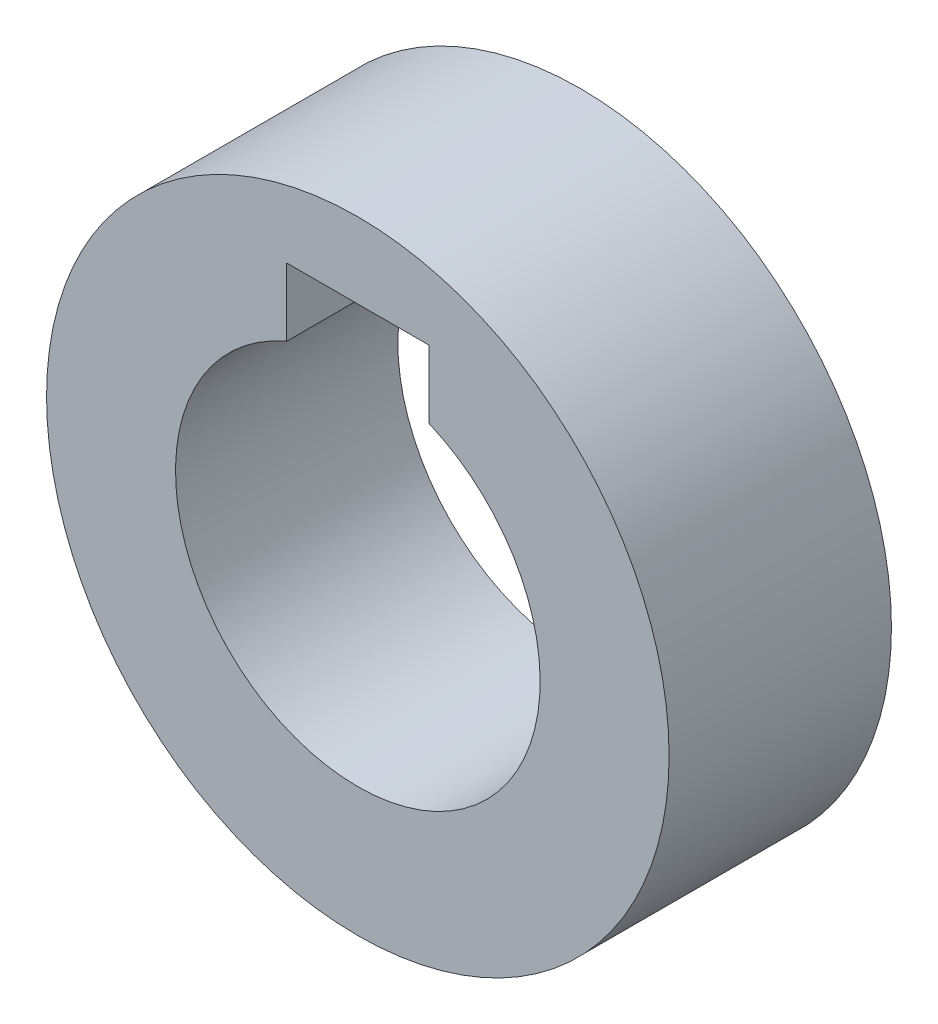
ISO-10303-21;
HEADER;
FILE_DESCRIPTION(('STEP AP214'),'2;1');
FILE_NAME('part.step','',(''),(''),'','','');
FILE_SCHEMA(('AUTOMOTIVE_DESIGN { 1 0 10303 214 1 1 1 1 }'));
ENDSEC;
DATA;
#1=APPLICATION_CONTEXT('core data for automotive mechanical design processes');
#2=APPLICATION_PROTOCOL_DEFINITION('international standard','automotive_design',2000,#1);
#3=PRODUCT_CONTEXT('',#1,'mechanical');
#4=PRODUCT('Part','Part','',(#3));
#5=PRODUCT_RELATED_PRODUCT_CATEGORY('part','',(#4));
#6=PRODUCT_DEFINITION_FORMATION('','',#4);
#7=PRODUCT_DEFINITION_CONTEXT('part definition',#1,'design');
#8=PRODUCT_DEFINITION('design','',#6,#7);
#9=PRODUCT_DEFINITION_SHAPE('','',#8);
#10=(LENGTH_UNIT() NAMED_UNIT(*) SI_UNIT(.MILLI.,.METRE.));
#11=(NAMED_UNIT(*) PLANE_ANGLE_UNIT() SI_UNIT($,.RADIAN.));
#12=(NAMED_UNIT(*) SI_UNIT($,.STERADIAN.) SOLID_ANGLE_UNIT());
#13=UNCERTAINTY_MEASURE_WITH_UNIT(LENGTH_MEASURE(1.E-05),#10,'distance_accuracy_value','');
#14=(GEOMETRIC_REPRESENTATION_CONTEXT(3) GLOBAL_UNCERTAINTY_ASSIGNED_CONTEXT((#13)) GLOBAL_UNIT_ASSIGNED_CONTEXT((#10,
#11,#12)) REPRESENTATION_CONTEXT('',''));
#15=CARTESIAN_POINT('',(0.,0.,0.));
#16=DIRECTION('',(0.,0.,1.));
#17=DIRECTION('',(1.,0.,0.));
#18=AXIS2_PLACEMENT_3D('',#15,#16,#17);
#19=CARTESIAN_POINT('',(0.,0.,5.));
#20=DIRECTION('',(0.,0.,1.));
#21=DIRECTION('',(1.,0.,0.));
#22=AXIS2_PLACEMENT_3D('',#19,#20,#21);
#23=PLANE('',#22);
#24=CARTESIAN_POINT('',(0.,0.,5.));
#25=DIRECTION('',(0.,0.,1.));
#26=DIRECTION('',(1.,0.,0.));
#27=AXIS2_PLACEMENT_3D('',#24,#25,#26);
#28=CIRCLE('',#27,7.);
#29=CARTESIAN_POINT('',(7.,0.,5.));
#30=VERTEX_POINT('',#29);
#31=EDGE_CURVE('E12',#30,#30,#28,.T.);
#32=ORIENTED_EDGE('',*,*,#31,.T.);
#33=EDGE_LOOP('',(#32));
#34=FACE_BOUND('',#33,.T.);
#35=DIRECTION('',(0.,1.,0.));
#36=VECTOR('',#35,1.);
#37=CARTESIAN_POINT('',(1.6,5.3,5.));
#38=LINE('',#37,#36);
#39=CARTESIAN_POINT('',(1.6,3.77491721763537,5.));
#40=VERTEX_POINT('',#39);
#41=CARTESIAN_POINT('',(1.6,5.3,5.));
#42=VERTEX_POINT('',#41);
#43=EDGE_CURVE('E86',#40,#42,#38,.T.);
#44=ORIENTED_EDGE('',*,*,#43,.F.);
#45=CARTESIAN_POINT('',(0.,0.,5.));
#46=DIRECTION('',(0.,0.,1.));
#47=DIRECTION('',(1.,0.,0.));
#48=AXIS2_PLACEMENT_3D('',#45,#46,#47);
#49=CIRCLE('',#48,4.1);
#50=CARTESIAN_POINT('',(-1.6,3.77491721763537,5.));
#51=VERTEX_POINT('',#50);
#52=EDGE_CURVE('E77',#51,#40,#49,.T.);
#53=ORIENTED_EDGE('',*,*,#52,.F.);
#54=DIRECTION('',(0.,-1.,0.));
#55=VECTOR('',#54,1.);
#56=CARTESIAN_POINT('',(-1.6,3.77491721763537,5.));
#57=LINE('',#56,#55);
#58=CARTESIAN_POINT('',(-1.6,5.3,5.));
#59=VERTEX_POINT('',#58);
#60=EDGE_CURVE('E101',#59,#51,#57,.T.);
#61=ORIENTED_EDGE('',*,*,#60,.F.);
#62=DIRECTION('',(-1.,0.,0.));
#63=VECTOR('',#62,1.);
#64=CARTESIAN_POINT('',(-1.6,5.3,5.));
#65=LINE('',#64,#63);
#66=EDGE_CURVE('E97',#42,#59,#65,.T.);
#67=ORIENTED_EDGE('',*,*,#66,.F.);
#68=EDGE_LOOP('',(#44,#53,#61,#67));
#69=FACE_BOUND('',#68,.T.);
#70=ADVANCED_FACE('F35',(#34,#69),#23,.T.);
#71=CARTESIAN_POINT('',(0.,0.,0.));
#72=DIRECTION('',(0.,0.,1.));
#73=DIRECTION('',(1.,0.,0.));
#74=AXIS2_PLACEMENT_3D('',#71,#72,#73);
#75=PLANE('',#74);
#76=CARTESIAN_POINT('',(0.,0.,0.));
#77=DIRECTION('',(0.,0.,1.));
#78=DIRECTION('',(1.,0.,0.));
#79=AXIS2_PLACEMENT_3D('',#76,#77,#78);
#80=CIRCLE('',#79,7.);
#81=CARTESIAN_POINT('',(7.,0.,0.));
#82=VERTEX_POINT('',#81);
#83=EDGE_CURVE('E39',#82,#82,#80,.T.);
#84=ORIENTED_EDGE('',*,*,#83,.F.);
#85=EDGE_LOOP('',(#84));
#86=FACE_BOUND('',#85,.T.);
#87=CARTESIAN_POINT('',(0.,0.,0.));
#88=DIRECTION('',(0.,0.,1.));
#89=DIRECTION('',(1.,0.,0.));
#90=AXIS2_PLACEMENT_3D('',#87,#88,#89);
#91=CIRCLE('',#90,4.1);
#92=CARTESIAN_POINT('',(-1.6,3.77491721763537,0.));
#93=VERTEX_POINT('',#92);
#94=CARTESIAN_POINT('',(1.6,3.77491721763537,0.));
#95=VERTEX_POINT('',#94);
#96=EDGE_CURVE('E59',#93,#95,#91,.T.);
#97=ORIENTED_EDGE('',*,*,#96,.T.);
#98=DIRECTION('',(0.,1.,0.));
#99=VECTOR('',#98,1.);
#100=CARTESIAN_POINT('',(1.6,5.3,0.));
#101=LINE('',#100,#99);
#102=CARTESIAN_POINT('',(1.6,5.3,0.));
#103=VERTEX_POINT('',#102);
#104=EDGE_CURVE('E93',#95,#103,#101,.T.);
#105=ORIENTED_EDGE('',*,*,#104,.T.);
#106=DIRECTION('',(-1.,0.,0.));
#107=VECTOR('',#106,1.);
#108=CARTESIAN_POINT('',(-1.6,5.3,0.));
#109=LINE('',#108,#107);
#110=CARTESIAN_POINT('',(-1.6,5.3,0.));
#111=VERTEX_POINT('',#110);
#112=EDGE_CURVE('E114',#103,#111,#109,.T.);
#113=ORIENTED_EDGE('',*,*,#112,.T.);
#114=DIRECTION('',(0.,-1.,0.));
#115=VECTOR('',#114,1.);
#116=CARTESIAN_POINT('',(-1.6,3.77491721763537,0.));
#117=LINE('',#116,#115);
#118=EDGE_CURVE('E87',#111,#93,#117,.T.);
#119=ORIENTED_EDGE('',*,*,#118,.T.);
#120=EDGE_LOOP('',(#97,#105,#113,#119));
#121=FACE_BOUND('',#120,.T.);
#122=ADVANCED_FACE('F126',(#86,#121),#75,.F.);
#123=CARTESIAN_POINT('',(0.,0.,5.));
#124=DIRECTION('',(0.,0.,-1.));
#125=DIRECTION('',(-1.,0.,0.));
#126=AXIS2_PLACEMENT_3D('',#123,#124,#125);
#127=CYLINDRICAL_SURFACE('',#126,7.);
#128=ORIENTED_EDGE('',*,*,#31,.F.);
#129=EDGE_LOOP('',(#128));
#130=FACE_BOUND('',#129,.T.);
#131=ORIENTED_EDGE('',*,*,#83,.T.);
#132=EDGE_LOOP('',(#131));
#133=FACE_BOUND('',#132,.T.);
#134=ADVANCED_FACE('F37',(#130,#133),#127,.T.);
#135=CARTESIAN_POINT('',(0.,0.,5.));
#136=DIRECTION('',(0.,0.,-1.));
#137=DIRECTION('',(-1.,0.,0.));
#138=AXIS2_PLACEMENT_3D('',#135,#136,#137);
#139=CYLINDRICAL_SURFACE('',#138,4.1);
#140=ORIENTED_EDGE('',*,*,#96,.F.);
#141=DIRECTION('',(0.,0.,-1.));
#142=VECTOR('',#141,1.);
#143=CARTESIAN_POINT('',(-1.6,3.77491721763537,5.));
#144=LINE('',#143,#142);
#145=EDGE_CURVE('E81',#51,#93,#144,.T.);
#146=ORIENTED_EDGE('',*,*,#145,.F.);
#147=ORIENTED_EDGE('',*,*,#52,.T.);
#148=DIRECTION('',(0.,0.,-1.));
#149=VECTOR('',#148,1.);
#150=CARTESIAN_POINT('',(1.6,3.77491721763537,5.));
#151=LINE('',#150,#149);
#152=EDGE_CURVE('E80',#40,#95,#151,.T.);
#153=ORIENTED_EDGE('',*,*,#152,.T.);
#154=EDGE_LOOP('',(#140,#146,#147,#153));
#155=FACE_BOUND('',#154,.T.);
#156=ADVANCED_FACE('F79',(#155),#139,.F.);
#157=CARTESIAN_POINT('',(1.6,5.3,5.));
#158=DIRECTION('',(-1.,0.,0.));
#159=DIRECTION('',(0.,0.,1.));
#160=AXIS2_PLACEMENT_3D('',#157,#158,#159);
#161=PLANE('',#160);
#162=ORIENTED_EDGE('',*,*,#104,.F.);
#163=ORIENTED_EDGE('',*,*,#152,.F.);
#164=ORIENTED_EDGE('',*,*,#43,.T.);
#165=DIRECTION('',(0.,0.,-1.));
#166=VECTOR('',#165,1.);
#167=CARTESIAN_POINT('',(1.6,5.3,5.));
#168=LINE('',#167,#166);
#169=EDGE_CURVE('E94',#42,#103,#168,.T.);
#170=ORIENTED_EDGE('',*,*,#169,.T.);
#171=EDGE_LOOP('',(#162,#163,#164,#170));
#172=FACE_BOUND('',#171,.T.);
#173=ADVANCED_FACE('F90',(#172),#161,.T.);
#174=CARTESIAN_POINT('',(-1.6,5.3,5.));
#175=DIRECTION('',(0.,-1.,0.));
#176=DIRECTION('',(0.,0.,-1.));
#177=AXIS2_PLACEMENT_3D('',#174,#175,#176);
#178=PLANE('',#177);
#179=ORIENTED_EDGE('',*,*,#112,.F.);
#180=ORIENTED_EDGE('',*,*,#169,.F.);
#181=ORIENTED_EDGE('',*,*,#66,.T.);
#182=DIRECTION('',(0.,0.,-1.));
#183=VECTOR('',#182,1.);
#184=CARTESIAN_POINT('',(-1.6,5.3,5.));
#185=LINE('',#184,#183);
#186=EDGE_CURVE('E51',#59,#111,#185,.T.);
#187=ORIENTED_EDGE('',*,*,#186,.T.);
#188=EDGE_LOOP('',(#179,#180,#181,#187));
#189=FACE_BOUND('',#188,.T.);
#190=ADVANCED_FACE('F124',(#189),#178,.T.);
#191=CARTESIAN_POINT('',(-1.6,3.77491721763537,5.));
#192=DIRECTION('',(1.,0.,0.));
#193=DIRECTION('',(0.,0.,-1.));
#194=AXIS2_PLACEMENT_3D('',#191,#192,#193);
#195=PLANE('',#194);
#196=ORIENTED_EDGE('',*,*,#118,.F.);
#197=ORIENTED_EDGE('',*,*,#186,.F.);
#198=ORIENTED_EDGE('',*,*,#60,.T.);
#199=ORIENTED_EDGE('',*,*,#145,.T.);
#200=EDGE_LOOP('',(#196,#197,#198,#199));
#201=FACE_BOUND('',#200,.T.);
#202=ADVANCED_FACE('F127',(#201),#195,.T.);
#203=CLOSED_SHELL('',(#70,#122,#134,#156,#173,#190,#202));
#204=MANIFOLD_SOLID_BREP('B2',#203);
#205=ADVANCED_BREP_SHAPE_REPRESENTATION('',(#18,#204),#14);
#206=SHAPE_DEFINITION_REPRESENTATION(#9,#205);
ENDSEC;
END-ISO-10303-21;
